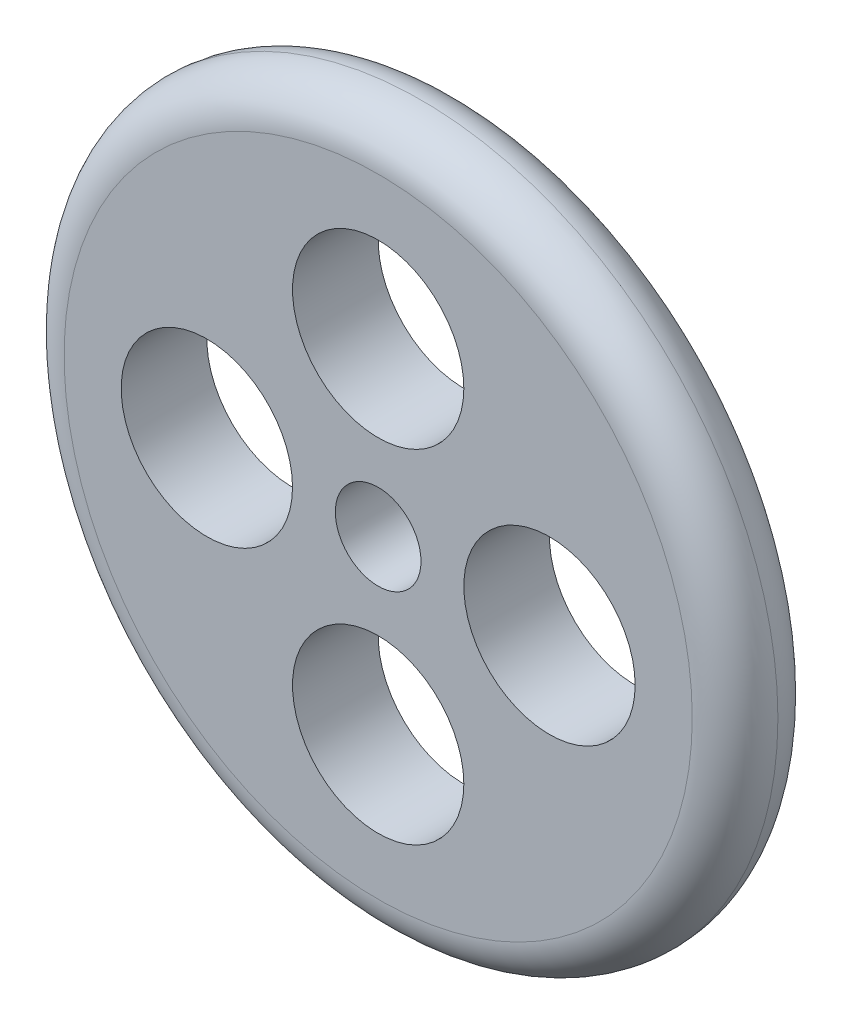
ISO-10303-21;
HEADER;
FILE_DESCRIPTION(('STEP AP214'),'2;1');
FILE_NAME('part.step','',(''),(''),'','','');
FILE_SCHEMA(('AUTOMOTIVE_DESIGN { 1 0 10303 214 1 1 1 1 }'));
ENDSEC;
DATA;
#1=APPLICATION_CONTEXT('core data for automotive mechanical design processes');
#2=APPLICATION_PROTOCOL_DEFINITION('international standard','automotive_design',2000,#1);
#3=PRODUCT_CONTEXT('',#1,'mechanical');
#4=PRODUCT('Part','Part','',(#3));
#5=PRODUCT_RELATED_PRODUCT_CATEGORY('part','',(#4));
#6=PRODUCT_DEFINITION_FORMATION('','',#4);
#7=PRODUCT_DEFINITION_CONTEXT('part definition',#1,'design');
#8=PRODUCT_DEFINITION('design','',#6,#7);
#9=PRODUCT_DEFINITION_SHAPE('','',#8);
#10=(LENGTH_UNIT() NAMED_UNIT(*) SI_UNIT(.MILLI.,.METRE.));
#11=(NAMED_UNIT(*) PLANE_ANGLE_UNIT() SI_UNIT($,.RADIAN.));
#12=(NAMED_UNIT(*) SI_UNIT($,.STERADIAN.) SOLID_ANGLE_UNIT());
#13=UNCERTAINTY_MEASURE_WITH_UNIT(LENGTH_MEASURE(1.E-05),#10,'distance_accuracy_value','');
#14=(GEOMETRIC_REPRESENTATION_CONTEXT(3) GLOBAL_UNCERTAINTY_ASSIGNED_CONTEXT((#13)) GLOBAL_UNIT_ASSIGNED_CONTEXT((#10,
#11,#12)) REPRESENTATION_CONTEXT('',''));
#15=CARTESIAN_POINT('',(0.,0.,0.));
#16=DIRECTION('',(0.,0.,1.));
#17=DIRECTION('',(1.,0.,0.));
#18=AXIS2_PLACEMENT_3D('',#15,#16,#17);
#19=CARTESIAN_POINT('',(0.,0.,30.));
#20=DIRECTION('',(0.,0.,1.));
#21=DIRECTION('',(1.,0.,0.));
#22=AXIS2_PLACEMENT_3D('',#19,#20,#21);
#23=PLANE('',#22);
#24=CARTESIAN_POINT('',(0.,-60.,30.));
#25=DIRECTION('',(0.,0.,1.));
#26=DIRECTION('',(1.,0.,0.));
#27=AXIS2_PLACEMENT_3D('',#24,#25,#26);
#28=CIRCLE('',#27,30.);
#29=CARTESIAN_POINT('',(30.,-60.,30.));
#30=VERTEX_POINT('',#29);
#31=EDGE_CURVE('E84',#30,#30,#28,.T.);
#32=ORIENTED_EDGE('',*,*,#31,.F.);
#33=EDGE_LOOP('',(#32));
#34=FACE_BOUND('',#33,.T.);
#35=CARTESIAN_POINT('',(60.,0.,30.));
#36=DIRECTION('',(0.,0.,1.));
#37=DIRECTION('',(1.,0.,0.));
#38=AXIS2_PLACEMENT_3D('',#35,#36,#37);
#39=CIRCLE('',#38,30.);
#40=CARTESIAN_POINT('',(90.,0.,30.));
#41=VERTEX_POINT('',#40);
#42=EDGE_CURVE('E76',#41,#41,#39,.T.);
#43=ORIENTED_EDGE('',*,*,#42,.F.);
#44=EDGE_LOOP('',(#43));
#45=FACE_BOUND('',#44,.T.);
#46=CARTESIAN_POINT('',(-60.,0.,30.));
#47=DIRECTION('',(0.,0.,1.));
#48=DIRECTION('',(1.,0.,0.));
#49=AXIS2_PLACEMENT_3D('',#46,#47,#48);
#50=CIRCLE('',#49,30.);
#51=CARTESIAN_POINT('',(-30.,0.,30.));
#52=VERTEX_POINT('',#51);
#53=EDGE_CURVE('E92',#52,#52,#50,.T.);
#54=ORIENTED_EDGE('',*,*,#53,.F.);
#55=EDGE_LOOP('',(#54));
#56=FACE_BOUND('',#55,.T.);
#57=CARTESIAN_POINT('',(0.,60.,30.));
#58=DIRECTION('',(0.,0.,1.));
#59=DIRECTION('',(1.,0.,0.));
#60=AXIS2_PLACEMENT_3D('',#57,#58,#59);
#61=CIRCLE('',#60,30.);
#62=CARTESIAN_POINT('',(30.,60.,30.));
#63=VERTEX_POINT('',#62);
#64=EDGE_CURVE('E72',#63,#63,#61,.T.);
#65=ORIENTED_EDGE('',*,*,#64,.F.);
#66=EDGE_LOOP('',(#65));
#67=FACE_BOUND('',#66,.T.);
#68=CARTESIAN_POINT('',(0.,0.,30.));
#69=DIRECTION('',(0.,0.,1.));
#70=DIRECTION('',(1.,0.,0.));
#71=AXIS2_PLACEMENT_3D('',#68,#69,#70);
#72=CIRCLE('',#71,15.);
#73=CARTESIAN_POINT('',(15.,0.,30.));
#74=VERTEX_POINT('',#73);
#75=EDGE_CURVE('E63',#74,#74,#72,.T.);
#76=ORIENTED_EDGE('',*,*,#75,.F.);
#77=EDGE_LOOP('',(#76));
#78=FACE_BOUND('',#77,.T.);
#79=CARTESIAN_POINT('',(0.,0.,30.));
#80=DIRECTION('',(0.,0.,1.));
#81=DIRECTION('',(1.,0.,0.));
#82=AXIS2_PLACEMENT_3D('',#79,#80,#81);
#83=CIRCLE('',#82,110.);
#84=CARTESIAN_POINT('',(110.,0.,30.));
#85=VERTEX_POINT('',#84);
#86=EDGE_CURVE('E10',#85,#85,#83,.T.);
#87=ORIENTED_EDGE('',*,*,#86,.T.);
#88=EDGE_LOOP('',(#87));
#89=FACE_BOUND('',#88,.T.);
#90=ADVANCED_FACE('F47',(#34,#45,#56,#67,#78,#89),#23,.T.);
#91=CARTESIAN_POINT('',(0.,0.,0.));
#92=DIRECTION('',(0.,0.,1.));
#93=DIRECTION('',(1.,0.,0.));
#94=AXIS2_PLACEMENT_3D('',#91,#92,#93);
#95=PLANE('',#94);
#96=CARTESIAN_POINT('',(0.,-60.,0.));
#97=DIRECTION('',(0.,0.,1.));
#98=DIRECTION('',(1.,0.,0.));
#99=AXIS2_PLACEMENT_3D('',#96,#97,#98);
#100=CIRCLE('',#99,30.);
#101=CARTESIAN_POINT('',(30.,-60.,0.));
#102=VERTEX_POINT('',#101);
#103=EDGE_CURVE('E88',#102,#102,#100,.T.);
#104=ORIENTED_EDGE('',*,*,#103,.T.);
#105=EDGE_LOOP('',(#104));
#106=FACE_BOUND('',#105,.T.);
#107=CARTESIAN_POINT('',(60.,0.,0.));
#108=DIRECTION('',(0.,0.,1.));
#109=DIRECTION('',(1.,0.,0.));
#110=AXIS2_PLACEMENT_3D('',#107,#108,#109);
#111=CIRCLE('',#110,30.);
#112=CARTESIAN_POINT('',(90.,0.,0.));
#113=VERTEX_POINT('',#112);
#114=EDGE_CURVE('E80',#113,#113,#111,.T.);
#115=ORIENTED_EDGE('',*,*,#114,.T.);
#116=EDGE_LOOP('',(#115));
#117=FACE_BOUND('',#116,.T.);
#118=CARTESIAN_POINT('',(-60.,0.,0.));
#119=DIRECTION('',(0.,0.,1.));
#120=DIRECTION('',(1.,0.,0.));
#121=AXIS2_PLACEMENT_3D('',#118,#119,#120);
#122=CIRCLE('',#121,30.);
#123=CARTESIAN_POINT('',(-30.,0.,0.));
#124=VERTEX_POINT('',#123);
#125=EDGE_CURVE('E96',#124,#124,#122,.T.);
#126=ORIENTED_EDGE('',*,*,#125,.T.);
#127=EDGE_LOOP('',(#126));
#128=FACE_BOUND('',#127,.T.);
#129=CARTESIAN_POINT('',(0.,60.,0.));
#130=DIRECTION('',(0.,0.,1.));
#131=DIRECTION('',(1.,0.,0.));
#132=AXIS2_PLACEMENT_3D('',#129,#130,#131);
#133=CIRCLE('',#132,30.);
#134=CARTESIAN_POINT('',(30.,60.,0.));
#135=VERTEX_POINT('',#134);
#136=EDGE_CURVE('E68',#135,#135,#133,.T.);
#137=ORIENTED_EDGE('',*,*,#136,.T.);
#138=EDGE_LOOP('',(#137));
#139=FACE_BOUND('',#138,.T.);
#140=CARTESIAN_POINT('',(0.,0.,0.));
#141=DIRECTION('',(0.,0.,1.));
#142=DIRECTION('',(1.,0.,0.));
#143=AXIS2_PLACEMENT_3D('',#140,#141,#142);
#144=CIRCLE('',#143,15.);
#145=CARTESIAN_POINT('',(15.,0.,0.));
#146=VERTEX_POINT('',#145);
#147=EDGE_CURVE('E67',#146,#146,#144,.T.);
#148=ORIENTED_EDGE('',*,*,#147,.T.);
#149=EDGE_LOOP('',(#148));
#150=FACE_BOUND('',#149,.T.);
#151=CARTESIAN_POINT('',(0.,0.,0.));
#152=DIRECTION('',(0.,0.,1.));
#153=DIRECTION('',(1.,0.,0.));
#154=AXIS2_PLACEMENT_3D('',#151,#152,#153);
#155=CIRCLE('',#154,110.);
#156=CARTESIAN_POINT('',(110.,0.,0.));
#157=VERTEX_POINT('',#156);
#158=EDGE_CURVE('E56',#157,#157,#155,.F.);
#159=ORIENTED_EDGE('',*,*,#158,.T.);
#160=EDGE_LOOP('',(#159));
#161=FACE_BOUND('',#160,.T.);
#162=ADVANCED_FACE('F108',(#106,#117,#128,#139,#150,#161),#95,.F.);
#163=CARTESIAN_POINT('',(0.,0.,15.));
#164=DIRECTION('',(0.,0.,1.));
#165=DIRECTION('',(1.,0.,0.));
#166=AXIS2_PLACEMENT_3D('',#163,#164,#165);
#167=TOROIDAL_SURFACE('',#166,110.,15.);
#168=ORIENTED_EDGE('',*,*,#86,.F.);
#169=EDGE_LOOP('',(#168));
#170=FACE_BOUND('',#169,.T.);
#171=CARTESIAN_POINT('',(0.,0.,15.));
#172=DIRECTION('',(0.,0.,1.));
#173=DIRECTION('',(1.,0.,0.));
#174=AXIS2_PLACEMENT_3D('',#171,#172,#173);
#175=CIRCLE('',#174,125.);
#176=CARTESIAN_POINT('',(125.,0.,15.));
#177=VERTEX_POINT('',#176);
#178=EDGE_CURVE('E51',#177,#177,#175,.F.);
#179=ORIENTED_EDGE('',*,*,#178,.F.);
#180=EDGE_LOOP('',(#179));
#181=FACE_BOUND('',#180,.T.);
#182=ADVANCED_FACE('F49',(#170,#181),#167,.T.);
#183=CARTESIAN_POINT('',(0.,0.,15.));
#184=DIRECTION('',(0.,0.,1.));
#185=DIRECTION('',(1.,0.,0.));
#186=AXIS2_PLACEMENT_3D('',#183,#184,#185);
#187=TOROIDAL_SURFACE('',#186,110.,15.);
#188=ORIENTED_EDGE('',*,*,#158,.F.);
#189=EDGE_LOOP('',(#188));
#190=FACE_BOUND('',#189,.T.);
#191=ORIENTED_EDGE('',*,*,#178,.T.);
#192=EDGE_LOOP('',(#191));
#193=FACE_BOUND('',#192,.T.);
#194=ADVANCED_FACE('F118',(#190,#193),#187,.T.);
#195=CARTESIAN_POINT('',(0.,0.,0.));
#196=DIRECTION('',(0.,0.,1.));
#197=DIRECTION('',(1.,0.,0.));
#198=AXIS2_PLACEMENT_3D('',#195,#196,#197);
#199=CYLINDRICAL_SURFACE('',#198,15.);
#200=ORIENTED_EDGE('',*,*,#147,.F.);
#201=EDGE_LOOP('',(#200));
#202=FACE_BOUND('',#201,.T.);
#203=ORIENTED_EDGE('',*,*,#75,.T.);
#204=EDGE_LOOP('',(#203));
#205=FACE_BOUND('',#204,.T.);
#206=ADVANCED_FACE('F115',(#202,#205),#199,.F.);
#207=CARTESIAN_POINT('',(0.,60.,0.));
#208=DIRECTION('',(0.,0.,1.));
#209=DIRECTION('',(1.,0.,0.));
#210=AXIS2_PLACEMENT_3D('',#207,#208,#209);
#211=CYLINDRICAL_SURFACE('',#210,30.);
#212=ORIENTED_EDGE('',*,*,#136,.F.);
#213=EDGE_LOOP('',(#212));
#214=FACE_BOUND('',#213,.T.);
#215=ORIENTED_EDGE('',*,*,#64,.T.);
#216=EDGE_LOOP('',(#215));
#217=FACE_BOUND('',#216,.T.);
#218=ADVANCED_FACE('F117',(#214,#217),#211,.F.);
#219=CARTESIAN_POINT('',(-60.,0.,0.));
#220=DIRECTION('',(0.,0.,1.));
#221=DIRECTION('',(1.,0.,0.));
#222=AXIS2_PLACEMENT_3D('',#219,#220,#221);
#223=CYLINDRICAL_SURFACE('',#222,30.);
#224=ORIENTED_EDGE('',*,*,#125,.F.);
#225=EDGE_LOOP('',(#224));
#226=FACE_BOUND('',#225,.T.);
#227=ORIENTED_EDGE('',*,*,#53,.T.);
#228=EDGE_LOOP('',(#227));
#229=FACE_BOUND('',#228,.T.);
#230=ADVANCED_FACE('F104',(#226,#229),#223,.F.);
#231=CARTESIAN_POINT('',(60.,0.,0.));
#232=DIRECTION('',(0.,0.,1.));
#233=DIRECTION('',(1.,0.,0.));
#234=AXIS2_PLACEMENT_3D('',#231,#232,#233);
#235=CYLINDRICAL_SURFACE('',#234,30.);
#236=ORIENTED_EDGE('',*,*,#114,.F.);
#237=EDGE_LOOP('',(#236));
#238=FACE_BOUND('',#237,.T.);
#239=ORIENTED_EDGE('',*,*,#42,.T.);
#240=EDGE_LOOP('',(#239));
#241=FACE_BOUND('',#240,.T.);
#242=ADVANCED_FACE('F155',(#238,#241),#235,.F.);
#243=CARTESIAN_POINT('',(0.,-60.,0.));
#244=DIRECTION('',(0.,0.,1.));
#245=DIRECTION('',(1.,0.,0.));
#246=AXIS2_PLACEMENT_3D('',#243,#244,#245);
#247=CYLINDRICAL_SURFACE('',#246,30.);
#248=ORIENTED_EDGE('',*,*,#103,.F.);
#249=EDGE_LOOP('',(#248));
#250=FACE_BOUND('',#249,.T.);
#251=ORIENTED_EDGE('',*,*,#31,.T.);
#252=EDGE_LOOP('',(#251));
#253=FACE_BOUND('',#252,.T.);
#254=ADVANCED_FACE('F160',(#250,#253),#247,.F.);
#255=CLOSED_SHELL('',(#90,#162,#182,#194,#206,#218,#230,#242,#254));
#256=MANIFOLD_SOLID_BREP('B2',#255);
#257=ADVANCED_BREP_SHAPE_REPRESENTATION('',(#18,#256),#14);
#258=SHAPE_DEFINITION_REPRESENTATION(#9,#257);
ENDSEC;
END-ISO-10303-21;
